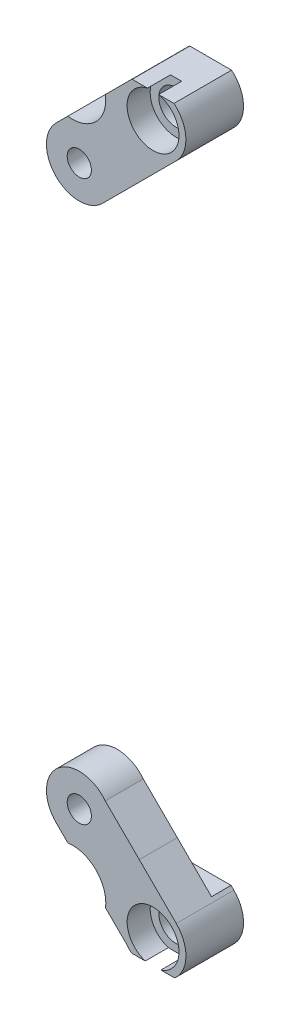
ISO-10303-21;
HEADER;
FILE_DESCRIPTION(('STEP AP214'),'2;1');
FILE_NAME('part.step','',(''),(''),'','','');
FILE_SCHEMA(('AUTOMOTIVE_DESIGN { 1 0 10303 214 1 1 1 1 }'));
ENDSEC;
DATA;
#1=APPLICATION_CONTEXT('core data for automotive mechanical design processes');
#2=APPLICATION_PROTOCOL_DEFINITION('international standard','automotive_design',2000,#1);
#3=PRODUCT_CONTEXT('',#1,'mechanical');
#4=PRODUCT('Part','Part','',(#3));
#5=PRODUCT_RELATED_PRODUCT_CATEGORY('part','',(#4));
#6=PRODUCT_DEFINITION_FORMATION('','',#4);
#7=PRODUCT_DEFINITION_CONTEXT('part definition',#1,'design');
#8=PRODUCT_DEFINITION('design','',#6,#7);
#9=PRODUCT_DEFINITION_SHAPE('','',#8);
#10=(LENGTH_UNIT() NAMED_UNIT(*) SI_UNIT(.MILLI.,.METRE.));
#11=(NAMED_UNIT(*) PLANE_ANGLE_UNIT() SI_UNIT($,.RADIAN.));
#12=(NAMED_UNIT(*) SI_UNIT($,.STERADIAN.) SOLID_ANGLE_UNIT());
#13=UNCERTAINTY_MEASURE_WITH_UNIT(LENGTH_MEASURE(1.E-05),#10,'distance_accuracy_value','');
#14=(GEOMETRIC_REPRESENTATION_CONTEXT(3) GLOBAL_UNCERTAINTY_ASSIGNED_CONTEXT((#13)) GLOBAL_UNIT_ASSIGNED_CONTEXT((#10,
#11,#12)) REPRESENTATION_CONTEXT('',''));
#15=CARTESIAN_POINT('',(0.,0.,0.));
#16=DIRECTION('',(0.,0.,1.));
#17=DIRECTION('',(1.,0.,0.));
#18=AXIS2_PLACEMENT_3D('',#15,#16,#17);
#19=CARTESIAN_POINT('',(-43.5767292653663,30.2864984479286,5.));
#20=DIRECTION('',(0.,0.,-1.));
#21=DIRECTION('',(-1.,0.,0.));
#22=AXIS2_PLACEMENT_3D('',#19,#20,#21);
#23=CYLINDRICAL_SURFACE('',#22,1.5);
#24=CARTESIAN_POINT('',(-43.5767292653663,30.2864984479286,0.));
#25=DIRECTION('',(0.,0.,1.));
#26=DIRECTION('',(1.,0.,0.));
#27=AXIS2_PLACEMENT_3D('',#24,#25,#26);
#28=CIRCLE('',#27,1.5);
#29=CARTESIAN_POINT('',(-42.0767292653662,30.2864984479286,0.));
#30=VERTEX_POINT('',#29);
#31=EDGE_CURVE('E175',#30,#30,#28,.T.);
#32=ORIENTED_EDGE('',*,*,#31,.F.);
#33=EDGE_LOOP('',(#32));
#34=FACE_BOUND('',#33,.T.);
#35=CARTESIAN_POINT('',(-43.5767292653663,30.2864984479286,3.));
#36=DIRECTION('',(0.,0.,1.));
#37=DIRECTION('',(1.,0.,0.));
#38=AXIS2_PLACEMENT_3D('',#35,#36,#37);
#39=CIRCLE('',#38,1.5);
#40=CARTESIAN_POINT('',(-42.0767292653662,30.2864984479286,3.));
#41=VERTEX_POINT('',#40);
#42=EDGE_CURVE('E46',#41,#41,#39,.T.);
#43=ORIENTED_EDGE('',*,*,#42,.T.);
#44=EDGE_LOOP('',(#43));
#45=FACE_BOUND('',#44,.T.);
#46=ADVANCED_FACE('F42',(#34,#45),#23,.F.);
#47=CARTESIAN_POINT('',(-38.9474106843814,38.9474106843816,5.));
#48=DIRECTION('',(-0.707106781186546,0.707106781186549,0.));
#49=DIRECTION('',(-0.707106781186549,-0.707106781186546,0.));
#50=AXIS2_PLACEMENT_3D('',#47,#48,#49);
#51=PLANE('',#50);
#52=DIRECTION('',(0.,0.,-1.));
#53=VECTOR('',#52,1.);
#54=CARTESIAN_POINT('',(-50.9797211058303,26.9151002629328,5.));
#55=LINE('',#54,#53);
#56=CARTESIAN_POINT('',(-50.9797211058303,26.9151002629328,5.));
#57=VERTEX_POINT('',#56);
#58=CARTESIAN_POINT('',(-50.9797211058303,26.9151002629328,1.7));
#59=VERTEX_POINT('',#58);
#60=EDGE_CURVE('E200',#57,#59,#55,.T.);
#61=ORIENTED_EDGE('',*,*,#60,.T.);
#62=DIRECTION('',(-0.707106781186549,-0.707106781186546,0.));
#63=VECTOR('',#62,1.);
#64=CARTESIAN_POINT('',(-38.9474106843814,38.9474106843816,1.7));
#65=LINE('',#64,#63);
#66=CARTESIAN_POINT('',(-51.9925274332672,25.9022939354959,1.7));
#67=VERTEX_POINT('',#66);
#68=EDGE_CURVE('E163',#59,#67,#65,.T.);
#69=ORIENTED_EDGE('',*,*,#68,.T.);
#70=DIRECTION('',(0.,0.,-1.));
#71=VECTOR('',#70,1.);
#72=CARTESIAN_POINT('',(-51.9925274332672,25.9022939354959,5.));
#73=LINE('',#72,#71);
#74=CARTESIAN_POINT('',(-51.9925274332672,25.9022939354959,5.));
#75=VERTEX_POINT('',#74);
#76=EDGE_CURVE('E235',#75,#67,#73,.T.);
#77=ORIENTED_EDGE('',*,*,#76,.F.);
#78=DIRECTION('',(0.707106781186549,0.707106781186546,0.));
#79=VECTOR('',#78,1.);
#80=CARTESIAN_POINT('',(-38.9474106843814,38.9474106843816,5.));
#81=LINE('',#80,#79);
#82=EDGE_CURVE('E171',#75,#57,#81,.T.);
#83=ORIENTED_EDGE('',*,*,#82,.T.);
#84=EDGE_LOOP('',(#61,#69,#77,#83));
#85=FACE_BOUND('',#84,.T.);
#86=ADVANCED_FACE('F44',(#85),#51,.T.);
#87=CARTESIAN_POINT('',(-49.9739446868777,23.8903735354853,5.));
#88=DIRECTION('',(0.,0.,-1.));
#89=DIRECTION('',(-1.,0.,0.));
#90=AXIS2_PLACEMENT_3D('',#87,#88,#89);
#91=CYLINDRICAL_SURFACE('',#90,2.85000000000001);
#92=CARTESIAN_POINT('',(-49.9739446868777,23.8903735354853,1.7));
#93=DIRECTION('',(0.,0.,-1.));
#94=DIRECTION('',(-1.,0.,0.));
#95=AXIS2_PLACEMENT_3D('',#92,#93,#94);
#96=CIRCLE('',#95,2.85000000000001);
#97=CARTESIAN_POINT('',(-48.006092917117,21.8288063131397,1.7));
#98=VERTEX_POINT('',#97);
#99=EDGE_CURVE('E166',#98,#67,#96,.T.);
#100=ORIENTED_EDGE('',*,*,#99,.F.);
#101=DIRECTION('',(0.,0.,-1.));
#102=VECTOR('',#101,1.);
#103=CARTESIAN_POINT('',(-48.006092917117,21.8288063131397,5.));
#104=LINE('',#103,#102);
#105=CARTESIAN_POINT('',(-48.006092917117,21.8288063131397,5.));
#106=VERTEX_POINT('',#105);
#107=EDGE_CURVE('E232',#106,#98,#104,.T.);
#108=ORIENTED_EDGE('',*,*,#107,.F.);
#109=CARTESIAN_POINT('',(-49.9739446868777,23.8903735354853,5.));
#110=DIRECTION('',(0.,0.,1.));
#111=DIRECTION('',(1.,0.,0.));
#112=AXIS2_PLACEMENT_3D('',#109,#110,#111);
#113=CIRCLE('',#112,2.85000000000001);
#114=EDGE_CURVE('E174',#75,#106,#113,.T.);
#115=ORIENTED_EDGE('',*,*,#114,.F.);
#116=ORIENTED_EDGE('',*,*,#76,.T.);
#117=EDGE_LOOP('',(#100,#108,#115,#116));
#118=FACE_BOUND('',#117,.T.);
#119=ADVANCED_FACE('F255',(#118),#91,.T.);
#120=CARTESIAN_POINT('',(-49.9739446868777,23.8903735354853,5.));
#121=DIRECTION('',(0.,0.,-1.));
#122=DIRECTION('',(-1.,0.,0.));
#123=AXIS2_PLACEMENT_3D('',#120,#121,#122);
#124=CYLINDRICAL_SURFACE('',#123,1.05);
#125=CARTESIAN_POINT('',(-49.9739446868777,23.8903735354853,5.));
#126=DIRECTION('',(0.,0.,1.));
#127=DIRECTION('',(1.,0.,0.));
#128=AXIS2_PLACEMENT_3D('',#125,#126,#127);
#129=CIRCLE('',#128,1.05);
#130=CARTESIAN_POINT('',(-48.9239446868777,23.8903735354853,5.));
#131=VERTEX_POINT('',#130);
#132=EDGE_CURVE('E197',#131,#131,#129,.T.);
#133=ORIENTED_EDGE('',*,*,#132,.T.);
#134=EDGE_LOOP('',(#133));
#135=FACE_BOUND('',#134,.T.);
#136=CARTESIAN_POINT('',(-49.9739446868777,23.8903735354853,1.7));
#137=DIRECTION('',(0.,0.,-1.));
#138=DIRECTION('',(-1.,0.,0.));
#139=AXIS2_PLACEMENT_3D('',#136,#137,#138);
#140=CIRCLE('',#139,1.05);
#141=CARTESIAN_POINT('',(-51.0239446868777,23.8903735354853,1.7));
#142=VERTEX_POINT('',#141);
#143=EDGE_CURVE('E159',#142,#142,#140,.T.);
#144=ORIENTED_EDGE('',*,*,#143,.T.);
#145=EDGE_LOOP('',(#144));
#146=FACE_BOUND('',#145,.T.);
#147=ADVANCED_FACE('F242',(#135,#146),#124,.F.);
#148=CARTESIAN_POINT('',(-34.9093780898652,34.9211139812419,5.));
#149=DIRECTION('',(-0.706987933025116,0.707225609375731,0.));
#150=DIRECTION('',(-0.707225609375731,-0.706987933025116,0.));
#151=AXIS2_PLACEMENT_3D('',#148,#149,#150);
#152=PLANE('',#151);
#153=DIRECTION('',(-0.707225609375731,-0.706987933025116,0.));
#154=VECTOR('',#153,1.);
#155=CARTESIAN_POINT('',(-34.9093780898652,34.9211139812419,1.7));
#156=LINE('',#155,#154);
#157=CARTESIAN_POINT('',(-41.7592284762038,28.0735656148252,1.7));
#158=VERTEX_POINT('',#157);
#159=EDGE_CURVE('E168',#158,#98,#156,.T.);
#160=ORIENTED_EDGE('',*,*,#159,.F.);
#161=DIRECTION('',(0.,0.,-1.));
#162=VECTOR('',#161,1.);
#163=CARTESIAN_POINT('',(-41.7592284762038,28.0735656148252,5.));
#164=LINE('',#163,#162);
#165=CARTESIAN_POINT('',(-41.7592284762038,28.0735656148252,0.));
#166=VERTEX_POINT('',#165);
#167=EDGE_CURVE('E156',#158,#166,#164,.T.);
#168=ORIENTED_EDGE('',*,*,#167,.T.);
#169=DIRECTION('',(0.707225609375731,0.706987933025116,0.));
#170=VECTOR('',#169,1.);
#171=CARTESIAN_POINT('',(-34.9093780898652,34.9211139812419,0.));
#172=LINE('',#171,#170);
#173=CARTESIAN_POINT('',(-41.5618197721783,28.2709079759755,0.));
#174=VERTEX_POINT('',#173);
#175=EDGE_CURVE('E170',#166,#174,#172,.T.);
#176=ORIENTED_EDGE('',*,*,#175,.T.);
#177=DIRECTION('',(0.,0.,-1.));
#178=VECTOR('',#177,1.);
#179=CARTESIAN_POINT('',(-41.5618197721783,28.2709079759755,5.));
#180=LINE('',#179,#178);
#181=CARTESIAN_POINT('',(-41.5618197721783,28.2709079759755,5.));
#182=VERTEX_POINT('',#181);
#183=EDGE_CURVE('E229',#182,#174,#180,.T.);
#184=ORIENTED_EDGE('',*,*,#183,.F.);
#185=DIRECTION('',(0.707225609375731,0.706987933025116,0.));
#186=VECTOR('',#185,1.);
#187=CARTESIAN_POINT('',(-34.9093780898652,34.9211139812419,5.));
#188=LINE('',#187,#186);
#189=CARTESIAN_POINT('',(-44.7807249254997,25.0530845957399,5.));
#190=VERTEX_POINT('',#189);
#191=EDGE_CURVE('E180',#190,#182,#188,.T.);
#192=ORIENTED_EDGE('',*,*,#191,.F.);
#193=DIRECTION('',(-0.707226241308526,-0.706987300879312,0.));
#194=VECTOR('',#193,1.);
#195=CARTESIAN_POINT('',(-34.9093380555816,34.921136361164,5.));
#196=LINE('',#195,#194);
#197=EDGE_CURVE('E177',#190,#106,#196,.T.);
#198=ORIENTED_EDGE('',*,*,#197,.T.);
#199=ORIENTED_EDGE('',*,*,#107,.T.);
#200=EDGE_LOOP('',(#160,#168,#176,#184,#192,#198,#199));
#201=FACE_BOUND('',#200,.T.);
#202=ADVANCED_FACE('F257',(#201),#152,.F.);
#203=CARTESIAN_POINT('',(-43.5767292653663,30.2864984479286,5.));
#204=DIRECTION('',(0.,0.,-1.));
#205=DIRECTION('',(-1.,0.,0.));
#206=AXIS2_PLACEMENT_3D('',#203,#204,#205);
#207=CYLINDRICAL_SURFACE('',#206,2.84999593173449);
#208=CARTESIAN_POINT('',(-43.5767292653663,30.2864984479286,0.));
#209=DIRECTION('',(0.,0.,1.));
#210=DIRECTION('',(1.,0.,0.));
#211=AXIS2_PLACEMENT_3D('',#208,#209,#210);
#212=CIRCLE('',#211,2.84999593173449);
#213=CARTESIAN_POINT('',(-41.7619570840613,32.4840175799065,0.));
#214=VERTEX_POINT('',#213);
#215=EDGE_CURVE('E202',#174,#214,#212,.T.);
#216=ORIENTED_EDGE('',*,*,#215,.T.);
#217=DIRECTION('',(0.,0.,-1.));
#218=VECTOR('',#217,1.);
#219=CARTESIAN_POINT('',(-41.7619570840613,32.4840175799065,5.));
#220=LINE('',#219,#218);
#221=CARTESIAN_POINT('',(-41.7619570840613,32.4840175799065,5.));
#222=VERTEX_POINT('',#221);
#223=EDGE_CURVE('E227',#222,#214,#220,.T.);
#224=ORIENTED_EDGE('',*,*,#223,.F.);
#225=CARTESIAN_POINT('',(-43.5767292653663,30.2864984479286,5.));
#226=DIRECTION('',(0.,0.,1.));
#227=DIRECTION('',(1.,0.,0.));
#228=AXIS2_PLACEMENT_3D('',#225,#226,#227);
#229=CIRCLE('',#228,2.84999593173449);
#230=EDGE_CURVE('E182',#182,#222,#229,.T.);
#231=ORIENTED_EDGE('',*,*,#230,.F.);
#232=ORIENTED_EDGE('',*,*,#183,.T.);
#233=EDGE_LOOP('',(#216,#224,#231,#232));
#234=FACE_BOUND('',#233,.T.);
#235=ADVANCED_FACE('F277',(#234),#207,.T.);
#236=CARTESIAN_POINT('',(0.,32.4840175799065,5.));
#237=DIRECTION('',(0.,1.,0.));
#238=DIRECTION('',(0.,0.,1.));
#239=AXIS2_PLACEMENT_3D('',#236,#237,#238);
#240=PLANE('',#239);
#241=DIRECTION('',(0.,0.,1.));
#242=VECTOR('',#241,1.);
#243=CARTESIAN_POINT('',(-44.0598541608032,32.4840175799065,3.));
#244=LINE('',#243,#242);
#245=CARTESIAN_POINT('',(-44.0598541608032,32.4840175799065,3.));
#246=VERTEX_POINT('',#245);
#247=CARTESIAN_POINT('',(-44.0598541608032,32.4840175799065,5.));
#248=VERTEX_POINT('',#247);
#249=EDGE_CURVE('E57',#246,#248,#244,.T.);
#250=ORIENTED_EDGE('',*,*,#249,.F.);
#251=DIRECTION('',(1.,0.,0.));
#252=VECTOR('',#251,1.);
#253=CARTESIAN_POINT('',(0.,32.4840175799065,3.));
#254=LINE('',#253,#252);
#255=CARTESIAN_POINT('',(-43.0936043699293,32.4840175799065,3.));
#256=VERTEX_POINT('',#255);
#257=EDGE_CURVE('E144',#246,#256,#254,.T.);
#258=ORIENTED_EDGE('',*,*,#257,.T.);
#259=DIRECTION('',(0.,0.,1.));
#260=VECTOR('',#259,1.);
#261=CARTESIAN_POINT('',(-43.0936043699293,32.4840175799065,3.));
#262=LINE('',#261,#260);
#263=CARTESIAN_POINT('',(-43.0936043699293,32.4840175799065,5.));
#264=VERTEX_POINT('',#263);
#265=EDGE_CURVE('E134',#264,#256,#262,.F.);
#266=ORIENTED_EDGE('',*,*,#265,.F.);
#267=DIRECTION('',(1.,0.,0.));
#268=VECTOR('',#267,1.);
#269=CARTESIAN_POINT('',(0.,32.4840175799065,5.));
#270=LINE('',#269,#268);
#271=EDGE_CURVE('E185',#264,#222,#270,.T.);
#272=ORIENTED_EDGE('',*,*,#271,.T.);
#273=ORIENTED_EDGE('',*,*,#223,.T.);
#274=DIRECTION('',(1.,0.,0.));
#275=VECTOR('',#274,1.);
#276=CARTESIAN_POINT('',(0.,32.4840175799065,0.));
#277=LINE('',#276,#275);
#278=CARTESIAN_POINT('',(-45.3915040371906,32.4840175799065,0.));
#279=VERTEX_POINT('',#278);
#280=EDGE_CURVE('E205',#279,#214,#277,.T.);
#281=ORIENTED_EDGE('',*,*,#280,.F.);
#282=DIRECTION('',(0.,0.,-1.));
#283=VECTOR('',#282,1.);
#284=CARTESIAN_POINT('',(-45.3915040371906,32.4840175799065,5.));
#285=LINE('',#284,#283);
#286=CARTESIAN_POINT('',(-45.3915040371906,32.4840175799065,5.));
#287=VERTEX_POINT('',#286);
#288=EDGE_CURVE('E225',#287,#279,#285,.T.);
#289=ORIENTED_EDGE('',*,*,#288,.F.);
#290=EDGE_CURVE('E186',#287,#248,#270,.T.);
#291=ORIENTED_EDGE('',*,*,#290,.T.);
#292=EDGE_LOOP('',(#250,#258,#266,#272,#273,#281,#289,#291));
#293=FACE_BOUND('',#292,.T.);
#294=ADVANCED_FACE('F146',(#293),#240,.T.);
#295=CARTESIAN_POINT('',(-36.5723461205655,40.4564702820381,5.));
#296=DIRECTION('',(-0.670599421401496,0.741819665428182,0.));
#297=DIRECTION('',(-0.741819665428182,-0.670599421401496,0.));
#298=AXIS2_PLACEMENT_3D('',#295,#296,#297);
#299=PLANE('',#298);
#300=DIRECTION('',(0.741819665428182,0.670599421401496,0.));
#301=VECTOR('',#300,1.);
#302=CARTESIAN_POINT('',(-36.5723461205655,40.4564702820381,0.));
#303=LINE('',#302,#301);
#304=CARTESIAN_POINT('',(-45.5925274332672,32.3022939354959,0.));
#305=VERTEX_POINT('',#304);
#306=EDGE_CURVE('E208',#305,#279,#303,.T.);
#307=ORIENTED_EDGE('',*,*,#306,.F.);
#308=DIRECTION('',(0.,0.,-1.));
#309=VECTOR('',#308,1.);
#310=CARTESIAN_POINT('',(-45.5925274332672,32.3022939354959,5.));
#311=LINE('',#310,#309);
#312=CARTESIAN_POINT('',(-45.5925274332672,32.3022939354959,5.));
#313=VERTEX_POINT('',#312);
#314=EDGE_CURVE('E223',#313,#305,#311,.T.);
#315=ORIENTED_EDGE('',*,*,#314,.F.);
#316=DIRECTION('',(0.741819665428182,0.670599421401496,0.));
#317=VECTOR('',#316,1.);
#318=CARTESIAN_POINT('',(-36.5723461205655,40.4564702820381,5.));
#319=LINE('',#318,#317);
#320=EDGE_CURVE('E188',#313,#287,#319,.T.);
#321=ORIENTED_EDGE('',*,*,#320,.T.);
#322=ORIENTED_EDGE('',*,*,#288,.T.);
#323=EDGE_LOOP('',(#307,#315,#321,#322));
#324=FACE_BOUND('',#323,.T.);
#325=ADVANCED_FACE('F284',(#324),#299,.T.);
#326=CARTESIAN_POINT('',(-38.9474106843815,38.9474106843815,5.));
#327=DIRECTION('',(-0.707106781186548,0.707106781186548,0.));
#328=DIRECTION('',(-0.707106781186548,-0.707106781186548,0.));
#329=AXIS2_PLACEMENT_3D('',#326,#327,#328);
#330=PLANE('',#329);
#331=DIRECTION('',(0.707106781186548,0.707106781186548,0.));
#332=VECTOR('',#331,1.);
#333=CARTESIAN_POINT('',(-38.9474106843815,38.9474106843815,0.));
#334=LINE('',#333,#332);
#335=CARTESIAN_POINT('',(-47.705333760704,30.1894876080591,0.));
#336=VERTEX_POINT('',#335);
#337=EDGE_CURVE('E211',#336,#305,#334,.T.);
#338=ORIENTED_EDGE('',*,*,#337,.F.);
#339=DIRECTION('',(0.,0.,-1.));
#340=VECTOR('',#339,1.);
#341=CARTESIAN_POINT('',(-47.705333760704,30.1894876080591,5.));
#342=LINE('',#341,#340);
#343=CARTESIAN_POINT('',(-47.705333760704,30.1894876080591,5.));
#344=VERTEX_POINT('',#343);
#345=EDGE_CURVE('E220',#344,#336,#342,.T.);
#346=ORIENTED_EDGE('',*,*,#345,.F.);
#347=DIRECTION('',(0.707106781186548,0.707106781186548,0.));
#348=VECTOR('',#347,1.);
#349=CARTESIAN_POINT('',(-38.9474106843815,38.9474106843815,5.));
#350=LINE('',#349,#348);
#351=EDGE_CURVE('E191',#344,#313,#350,.T.);
#352=ORIENTED_EDGE('',*,*,#351,.T.);
#353=ORIENTED_EDGE('',*,*,#314,.T.);
#354=EDGE_LOOP('',(#338,#346,#352,#353));
#355=FACE_BOUND('',#354,.T.);
#356=ADVANCED_FACE('F286',(#355),#330,.T.);
#357=CARTESIAN_POINT('',(-50.5772731068855,29.7870396091142,5.));
#358=DIRECTION('',(0.,0.,-1.));
#359=DIRECTION('',(-1.,0.,0.));
#360=AXIS2_PLACEMENT_3D('',#357,#358,#359);
#361=CYLINDRICAL_SURFACE('',#360,2.9);
#362=DIRECTION('',(0.,0.,-1.));
#363=VECTOR('',#362,1.);
#364=CARTESIAN_POINT('',(-48.2376135438517,28.0735656148252,5.));
#365=LINE('',#364,#363);
#366=CARTESIAN_POINT('',(-48.2376135438517,28.0735656148252,1.7));
#367=VERTEX_POINT('',#366);
#368=CARTESIAN_POINT('',(-48.2376135438517,28.0735656148252,0.));
#369=VERTEX_POINT('',#368);
#370=EDGE_CURVE('E65',#367,#369,#365,.T.);
#371=ORIENTED_EDGE('',*,*,#370,.F.);
#372=CARTESIAN_POINT('',(-50.5772731068855,29.7870396091142,1.7));
#373=DIRECTION('',(0.,0.,-1.));
#374=DIRECTION('',(-1.,0.,0.));
#375=AXIS2_PLACEMENT_3D('',#372,#373,#374);
#376=CIRCLE('',#375,2.9);
#377=EDGE_CURVE('E160',#367,#59,#376,.T.);
#378=ORIENTED_EDGE('',*,*,#377,.T.);
#379=ORIENTED_EDGE('',*,*,#60,.F.);
#380=CARTESIAN_POINT('',(-50.5772731068855,29.7870396091142,5.));
#381=DIRECTION('',(0.,0.,1.));
#382=DIRECTION('',(1.,0.,0.));
#383=AXIS2_PLACEMENT_3D('',#380,#381,#382);
#384=CIRCLE('',#383,2.9);
#385=EDGE_CURVE('E194',#57,#344,#384,.T.);
#386=ORIENTED_EDGE('',*,*,#385,.T.);
#387=ORIENTED_EDGE('',*,*,#345,.T.);
#388=CARTESIAN_POINT('',(-50.5772731068855,29.7870396091142,0.));
#389=DIRECTION('',(0.,0.,1.));
#390=DIRECTION('',(1.,0.,0.));
#391=AXIS2_PLACEMENT_3D('',#388,#389,#390);
#392=CIRCLE('',#391,2.9);
#393=EDGE_CURVE('E214',#369,#336,#392,.T.);
#394=ORIENTED_EDGE('',*,*,#393,.F.);
#395=EDGE_LOOP('',(#371,#378,#379,#386,#387,#394));
#396=FACE_BOUND('',#395,.T.);
#397=ADVANCED_FACE('F268',(#396),#361,.F.);
#398=CARTESIAN_POINT('',(0.,0.,5.));
#399=DIRECTION('',(0.,0.,1.));
#400=DIRECTION('',(1.,0.,0.));
#401=AXIS2_PLACEMENT_3D('',#398,#399,#400);
#402=PLANE('',#401);
#403=CARTESIAN_POINT('',(-43.5767292653663,30.2864984479286,5.));
#404=DIRECTION('',(0.,0.,1.));
#405=DIRECTION('',(1.,0.,0.));
#406=AXIS2_PLACEMENT_3D('',#403,#404,#405);
#407=CIRCLE('',#406,2.25);
#408=EDGE_CURVE('E12',#248,#264,#407,.T.);
#409=ORIENTED_EDGE('',*,*,#408,.F.);
#410=ORIENTED_EDGE('',*,*,#290,.F.);
#411=ORIENTED_EDGE('',*,*,#320,.F.);
#412=ORIENTED_EDGE('',*,*,#351,.F.);
#413=ORIENTED_EDGE('',*,*,#385,.F.);
#414=ORIENTED_EDGE('',*,*,#82,.F.);
#415=ORIENTED_EDGE('',*,*,#114,.T.);
#416=ORIENTED_EDGE('',*,*,#197,.F.);
#417=ORIENTED_EDGE('',*,*,#191,.T.);
#418=ORIENTED_EDGE('',*,*,#230,.T.);
#419=ORIENTED_EDGE('',*,*,#271,.F.);
#420=EDGE_LOOP('',(#409,#410,#411,#412,#413,#414,#415,#416,#417,#418,#419));
#421=FACE_BOUND('',#420,.T.);
#422=ORIENTED_EDGE('',*,*,#132,.F.);
#423=EDGE_LOOP('',(#422));
#424=FACE_BOUND('',#423,.T.);
#425=ADVANCED_FACE('F261',(#421,#424),#402,.T.);
#426=CARTESIAN_POINT('',(0.,0.,0.));
#427=DIRECTION('',(0.,0.,1.));
#428=DIRECTION('',(1.,0.,0.));
#429=AXIS2_PLACEMENT_3D('',#426,#427,#428);
#430=PLANE('',#429);
#431=ORIENTED_EDGE('',*,*,#175,.F.);
#432=DIRECTION('',(-1.,0.,0.));
#433=VECTOR('',#432,1.);
#434=CARTESIAN_POINT('',(0.,28.0735656148252,0.));
#435=LINE('',#434,#433);
#436=EDGE_CURVE('E51',#166,#369,#435,.T.);
#437=ORIENTED_EDGE('',*,*,#436,.T.);
#438=ORIENTED_EDGE('',*,*,#393,.T.);
#439=ORIENTED_EDGE('',*,*,#337,.T.);
#440=ORIENTED_EDGE('',*,*,#306,.T.);
#441=ORIENTED_EDGE('',*,*,#280,.T.);
#442=ORIENTED_EDGE('',*,*,#215,.F.);
#443=EDGE_LOOP('',(#431,#437,#438,#439,#440,#441,#442));
#444=FACE_BOUND('',#443,.T.);
#445=ORIENTED_EDGE('',*,*,#31,.T.);
#446=EDGE_LOOP('',(#445));
#447=FACE_BOUND('',#446,.T.);
#448=ADVANCED_FACE('F248',(#444,#447),#430,.F.);
#449=CARTESIAN_POINT('',(0.,0.,1.7));
#450=DIRECTION('',(0.,0.,-1.));
#451=DIRECTION('',(-1.,0.,0.));
#452=AXIS2_PLACEMENT_3D('',#449,#450,#451);
#453=PLANE('',#452);
#454=ORIENTED_EDGE('',*,*,#143,.F.);
#455=EDGE_LOOP('',(#454));
#456=FACE_BOUND('',#455,.T.);
#457=ORIENTED_EDGE('',*,*,#159,.T.);
#458=ORIENTED_EDGE('',*,*,#99,.T.);
#459=ORIENTED_EDGE('',*,*,#68,.F.);
#460=ORIENTED_EDGE('',*,*,#377,.F.);
#461=DIRECTION('',(1.,0.,0.));
#462=VECTOR('',#461,1.);
#463=CARTESIAN_POINT('',(-37.2430289190413,28.0735656148252,1.7));
#464=LINE('',#463,#462);
#465=EDGE_CURVE('E148',#367,#158,#464,.T.);
#466=ORIENTED_EDGE('',*,*,#465,.T.);
#467=EDGE_LOOP('',(#457,#458,#459,#460,#466));
#468=FACE_BOUND('',#467,.T.);
#469=ADVANCED_FACE('F244',(#456,#468),#453,.T.);
#470=CARTESIAN_POINT('',(-37.2430289190413,28.0735656148252,1.7));
#471=DIRECTION('',(0.,1.,0.));
#472=DIRECTION('',(0.,0.,1.));
#473=AXIS2_PLACEMENT_3D('',#470,#471,#472);
#474=PLANE('',#473);
#475=ORIENTED_EDGE('',*,*,#465,.F.);
#476=ORIENTED_EDGE('',*,*,#370,.T.);
#477=ORIENTED_EDGE('',*,*,#436,.F.);
#478=ORIENTED_EDGE('',*,*,#167,.F.);
#479=EDGE_LOOP('',(#475,#476,#477,#478));
#480=FACE_BOUND('',#479,.T.);
#481=ADVANCED_FACE('F247',(#480),#474,.F.);
#482=CARTESIAN_POINT('',(-43.5767292653663,30.2864984479286,3.));
#483=DIRECTION('',(0.,0.,1.));
#484=DIRECTION('',(1.,0.,0.));
#485=AXIS2_PLACEMENT_3D('',#482,#483,#484);
#486=CYLINDRICAL_SURFACE('',#485,2.25);
#487=ORIENTED_EDGE('',*,*,#249,.T.);
#488=ORIENTED_EDGE('',*,*,#408,.T.);
#489=ORIENTED_EDGE('',*,*,#265,.T.);
#490=CARTESIAN_POINT('',(-43.5767292653663,30.2864984479286,3.));
#491=DIRECTION('',(0.,0.,1.));
#492=DIRECTION('',(1.,0.,0.));
#493=AXIS2_PLACEMENT_3D('',#490,#491,#492);
#494=CIRCLE('',#493,2.25);
#495=EDGE_CURVE('E137',#246,#256,#494,.T.);
#496=ORIENTED_EDGE('',*,*,#495,.F.);
#497=EDGE_LOOP('',(#487,#488,#489,#496));
#498=FACE_BOUND('',#497,.T.);
#499=ADVANCED_FACE('F136',(#498),#486,.F.);
#500=CARTESIAN_POINT('',(-43.5767292653663,30.2864984479286,3.));
#501=DIRECTION('',(0.,0.,1.));
#502=DIRECTION('',(1.,0.,0.));
#503=AXIS2_PLACEMENT_3D('',#500,#501,#502);
#504=PLANE('',#503);
#505=ORIENTED_EDGE('',*,*,#42,.F.);
#506=EDGE_LOOP('',(#505));
#507=FACE_BOUND('',#506,.T.);
#508=ORIENTED_EDGE('',*,*,#495,.T.);
#509=ORIENTED_EDGE('',*,*,#257,.F.);
#510=EDGE_LOOP('',(#508,#509));
#511=FACE_BOUND('',#510,.T.);
#512=ADVANCED_FACE('F143',(#507,#511),#504,.T.);
#513=CLOSED_SHELL('',(#46,#86,#119,#147,#202,#235,#294,#325,#356,#397,#425,#448,#469,#481,#499,#512));
#514=MANIFOLD_SOLID_BREP('B2',#513);
#515=CARTESIAN_POINT('',(-43.5738675976098,-31.0495528823525,5.));
#516=DIRECTION('',(0.,0.,-1.));
#517=DIRECTION('',(-1.,0.,0.));
#518=AXIS2_PLACEMENT_3D('',#515,#516,#517);
#519=CYLINDRICAL_SURFACE('',#518,1.5);
#520=CARTESIAN_POINT('',(-43.5738675976098,-31.0495528823525,0.));
#521=DIRECTION('',(0.,0.,1.));
#522=DIRECTION('',(1.,0.,0.));
#523=AXIS2_PLACEMENT_3D('',#520,#521,#522);
#524=CIRCLE('',#523,1.5);
#525=CARTESIAN_POINT('',(-42.0738675976098,-31.0495528823525,0.));
#526=VERTEX_POINT('',#525);
#527=EDGE_CURVE('E568',#526,#526,#524,.T.);
#528=ORIENTED_EDGE('',*,*,#527,.F.);
#529=EDGE_LOOP('',(#528));
#530=FACE_BOUND('',#529,.T.);
#531=CARTESIAN_POINT('',(-43.5738675976098,-31.0495528823525,3.));
#532=DIRECTION('',(0.,0.,1.));
#533=DIRECTION('',(1.,0.,0.));
#534=AXIS2_PLACEMENT_3D('',#531,#532,#533);
#535=CIRCLE('',#534,1.5);
#536=CARTESIAN_POINT('',(-42.0738675976098,-31.0495528823525,3.));
#537=VERTEX_POINT('',#536);
#538=EDGE_CURVE('E436',#537,#537,#535,.T.);
#539=ORIENTED_EDGE('',*,*,#538,.T.);
#540=EDGE_LOOP('',(#539));
#541=FACE_BOUND('',#540,.T.);
#542=ADVANCED_FACE('F432',(#530,#541),#519,.F.);
#543=CARTESIAN_POINT('',(-35.1505085427414,-35.389381038265,5.));
#544=DIRECTION('',(-0.704708232186591,-0.709497221621374,0.));
#545=DIRECTION('',(0.709497221621374,-0.704708232186591,0.));
#546=AXIS2_PLACEMENT_3D('',#543,#544,#545);
#547=PLANE('',#546);
#548=DIRECTION('',(0.709497221621374,-0.704708232186591,0.));
#549=VECTOR('',#548,1.);
#550=CARTESIAN_POINT('',(-35.1505085427414,-35.389381038265,1.7));
#551=LINE('',#550,#549);
#552=CARTESIAN_POINT('',(-47.7217536048302,-22.9029898106238,1.7));
#553=VERTEX_POINT('',#552);
#554=CARTESIAN_POINT('',(-44.7701982058117,-25.8346226966411,1.7));
#555=VERTEX_POINT('',#554);
#556=EDGE_CURVE('E554',#553,#555,#551,.T.);
#557=ORIENTED_EDGE('',*,*,#556,.F.);
#558=DIRECTION('',(0.,0.,-1.));
#559=VECTOR('',#558,1.);
#560=CARTESIAN_POINT('',(-47.7217536048301,-22.9029898106238,5.));
#561=LINE('',#560,#559);
#562=CARTESIAN_POINT('',(-47.7217536048301,-22.9029898106238,5.));
#563=VERTEX_POINT('',#562);
#564=EDGE_CURVE('E628',#563,#553,#561,.T.);
#565=ORIENTED_EDGE('',*,*,#564,.F.);
#566=DIRECTION('',(-0.709497221621374,0.704708232186591,0.));
#567=VECTOR('',#566,1.);
#568=CARTESIAN_POINT('',(-35.1505085427414,-35.389381038265,5.));
#569=LINE('',#568,#567);
#570=CARTESIAN_POINT('',(-44.7701982058117,-25.8346226966411,5.));
#571=VERTEX_POINT('',#570);
#572=EDGE_CURVE('E564',#571,#563,#569,.T.);
#573=ORIENTED_EDGE('',*,*,#572,.F.);
#574=DIRECTION('',(0.,0.,-1.));
#575=VECTOR('',#574,1.);
#576=CARTESIAN_POINT('',(-44.7701982058117,-25.8346226966411,5.));
#577=LINE('',#576,#575);
#578=EDGE_CURVE('E590',#571,#555,#577,.T.);
#579=ORIENTED_EDGE('',*,*,#578,.T.);
#580=EDGE_LOOP('',(#557,#565,#573,#579));
#581=FACE_BOUND('',#580,.T.);
#582=ADVANCED_FACE('F434',(#581),#547,.F.);
#583=CARTESIAN_POINT('',(-49.9738675976098,-24.6495528823525,5.));
#584=DIRECTION('',(0.,0.,-1.));
#585=DIRECTION('',(-1.,0.,0.));
#586=AXIS2_PLACEMENT_3D('',#583,#584,#585);
#587=CYLINDRICAL_SURFACE('',#586,2.85);
#588=CARTESIAN_POINT('',(-49.9738675976098,-24.6495528823525,1.7));
#589=DIRECTION('',(0.,0.,-1.));
#590=DIRECTION('',(-1.,0.,0.));
#591=AXIS2_PLACEMENT_3D('',#588,#589,#590);
#592=CIRCLE('',#591,2.85);
#593=CARTESIAN_POINT('',(-51.9754271636713,-26.6784095316768,1.7));
#594=VERTEX_POINT('',#593);
#595=EDGE_CURVE('E556',#594,#553,#592,.T.);
#596=ORIENTED_EDGE('',*,*,#595,.F.);
#597=DIRECTION('',(0.,0.,-1.));
#598=VECTOR('',#597,1.);
#599=CARTESIAN_POINT('',(-51.9754271636713,-26.6784095316768,5.));
#600=LINE('',#599,#598);
#601=CARTESIAN_POINT('',(-51.9754271636713,-26.6784095316768,5.));
#602=VERTEX_POINT('',#601);
#603=EDGE_CURVE('E625',#602,#594,#600,.T.);
#604=ORIENTED_EDGE('',*,*,#603,.F.);
#605=CARTESIAN_POINT('',(-49.9738675976098,-24.6495528823525,5.));
#606=DIRECTION('',(0.,0.,1.));
#607=DIRECTION('',(1.,0.,0.));
#608=AXIS2_PLACEMENT_3D('',#605,#606,#607);
#609=CIRCLE('',#608,2.85);
#610=EDGE_CURVE('E567',#563,#602,#609,.T.);
#611=ORIENTED_EDGE('',*,*,#610,.F.);
#612=ORIENTED_EDGE('',*,*,#564,.T.);
#613=EDGE_LOOP('',(#596,#604,#611,#612));
#614=FACE_BOUND('',#613,.T.);
#615=ADVANCED_FACE('F649',(#614),#587,.T.);
#616=CARTESIAN_POINT('',(-39.1506076425322,-39.4166636325181,5.));
#617=DIRECTION('',(0.704708232186588,0.709497221621377,0.));
#618=DIRECTION('',(-0.709497221621377,0.704708232186588,0.));
#619=AXIS2_PLACEMENT_3D('',#616,#617,#618);
#620=PLANE('',#619);
#621=DIRECTION('',(-0.709497221621377,0.704708232186588,0.));
#622=VECTOR('',#621,1.);
#623=CARTESIAN_POINT('',(-39.1506076425322,-39.4166636325181,1.7));
#624=LINE('',#623,#622);
#625=CARTESIAN_POINT('',(-50.970278135918,-27.6767739689799,1.7));
#626=VERTEX_POINT('',#625);
#627=EDGE_CURVE('E558',#626,#594,#624,.T.);
#628=ORIENTED_EDGE('',*,*,#627,.F.);
#629=DIRECTION('',(0.,0.,-1.));
#630=VECTOR('',#629,1.);
#631=CARTESIAN_POINT('',(-50.970278135918,-27.6767739689799,5.));
#632=LINE('',#631,#630);
#633=CARTESIAN_POINT('',(-50.970278135918,-27.6767739689799,5.));
#634=VERTEX_POINT('',#633);
#635=EDGE_CURVE('E622',#634,#626,#632,.T.);
#636=ORIENTED_EDGE('',*,*,#635,.F.);
#637=DIRECTION('',(0.709497221621377,-0.704708232186588,0.));
#638=VECTOR('',#637,1.);
#639=CARTESIAN_POINT('',(-39.1506076425322,-39.4166636325181,5.));
#640=LINE('',#639,#638);
#641=EDGE_CURVE('E570',#602,#634,#640,.T.);
#642=ORIENTED_EDGE('',*,*,#641,.F.);
#643=ORIENTED_EDGE('',*,*,#603,.T.);
#644=EDGE_LOOP('',(#628,#636,#642,#643));
#645=FACE_BOUND('',#644,.T.);
#646=ADVANCED_FACE('F652',(#645),#620,.F.);
#647=CARTESIAN_POINT('',(-49.9738675976098,-24.6495528823525,5.));
#648=DIRECTION('',(0.,0.,-1.));
#649=DIRECTION('',(-1.,0.,0.));
#650=AXIS2_PLACEMENT_3D('',#647,#648,#649);
#651=CYLINDRICAL_SURFACE('',#650,1.05);
#652=CARTESIAN_POINT('',(-49.9738675976098,-24.6495528823525,5.));
#653=DIRECTION('',(0.,0.,1.));
#654=DIRECTION('',(1.,0.,0.));
#655=AXIS2_PLACEMENT_3D('',#652,#653,#654);
#656=CIRCLE('',#655,1.05);
#657=CARTESIAN_POINT('',(-48.9238675976098,-24.6495528823525,5.));
#658=VERTEX_POINT('',#657);
#659=EDGE_CURVE('E587',#658,#658,#656,.T.);
#660=ORIENTED_EDGE('',*,*,#659,.T.);
#661=EDGE_LOOP('',(#660));
#662=FACE_BOUND('',#661,.T.);
#663=CARTESIAN_POINT('',(-49.9738675976098,-24.6495528823525,1.7));
#664=DIRECTION('',(0.,0.,-1.));
#665=DIRECTION('',(-1.,0.,0.));
#666=AXIS2_PLACEMENT_3D('',#663,#664,#665);
#667=CIRCLE('',#666,1.05);
#668=CARTESIAN_POINT('',(-51.0238675976098,-24.6495528823525,1.7));
#669=VERTEX_POINT('',#668);
#670=EDGE_CURVE('E551',#669,#669,#667,.T.);
#671=ORIENTED_EDGE('',*,*,#670,.T.);
#672=EDGE_LOOP('',(#671));
#673=FACE_BOUND('',#672,.T.);
#674=ADVANCED_FACE('F635',(#662,#673),#651,.F.);
#675=CARTESIAN_POINT('',(-50.5738675976098,-30.5495528823525,5.));
#676=DIRECTION('',(0.,0.,-1.));
#677=DIRECTION('',(-1.,0.,0.));
#678=AXIS2_PLACEMENT_3D('',#675,#676,#677);
#679=CYLINDRICAL_SURFACE('',#678,2.9);
#680=DIRECTION('',(0.,0.,-1.));
#681=VECTOR('',#680,1.);
#682=CARTESIAN_POINT('',(-48.26929852544,-28.7891661658612,5.));
#683=LINE('',#682,#681);
#684=CARTESIAN_POINT('',(-48.26929852544,-28.7891661658612,0.));
#685=VERTEX_POINT('',#684);
#686=CARTESIAN_POINT('',(-48.26929852544,-28.7891661658612,1.7));
#687=VERTEX_POINT('',#686);
#688=EDGE_CURVE('E549',#685,#687,#683,.F.);
#689=ORIENTED_EDGE('',*,*,#688,.F.);
#690=CARTESIAN_POINT('',(-50.5738675976098,-30.5495528823525,0.));
#691=DIRECTION('',(0.,0.,1.));
#692=DIRECTION('',(1.,0.,0.));
#693=AXIS2_PLACEMENT_3D('',#690,#691,#692);
#694=CIRCLE('',#693,2.9);
#695=CARTESIAN_POINT('',(-47.698469833806,-30.926498103721,0.));
#696=VERTEX_POINT('',#695);
#697=EDGE_CURVE('E563',#696,#685,#694,.T.);
#698=ORIENTED_EDGE('',*,*,#697,.F.);
#699=DIRECTION('',(0.,0.,-1.));
#700=VECTOR('',#699,1.);
#701=CARTESIAN_POINT('',(-47.698469833806,-30.926498103721,5.));
#702=LINE('',#701,#700);
#703=CARTESIAN_POINT('',(-47.698469833806,-30.926498103721,5.));
#704=VERTEX_POINT('',#703);
#705=EDGE_CURVE('E620',#704,#696,#702,.T.);
#706=ORIENTED_EDGE('',*,*,#705,.F.);
#707=CARTESIAN_POINT('',(-50.5738675976098,-30.5495528823525,5.));
#708=DIRECTION('',(0.,0.,1.));
#709=DIRECTION('',(1.,0.,0.));
#710=AXIS2_PLACEMENT_3D('',#707,#708,#709);
#711=CIRCLE('',#710,2.9);
#712=EDGE_CURVE('E572',#704,#634,#711,.T.);
#713=ORIENTED_EDGE('',*,*,#712,.T.);
#714=ORIENTED_EDGE('',*,*,#635,.T.);
#715=CARTESIAN_POINT('',(-50.5738675976098,-30.5495528823525,1.7));
#716=DIRECTION('',(0.,0.,-1.));
#717=DIRECTION('',(-1.,0.,0.));
#718=AXIS2_PLACEMENT_3D('',#715,#716,#717);
#719=CIRCLE('',#718,2.9);
#720=EDGE_CURVE('E560',#626,#687,#719,.T.);
#721=ORIENTED_EDGE('',*,*,#720,.T.);
#722=EDGE_LOOP('',(#689,#698,#706,#713,#714,#721));
#723=FACE_BOUND('',#722,.T.);
#724=ADVANCED_FACE('F675',(#723),#679,.F.);
#725=CARTESIAN_POINT('',(-39.1506076425323,-39.416663632518,5.));
#726=DIRECTION('',(0.704708232186591,0.709497221621375,0.));
#727=DIRECTION('',(-0.709497221621375,0.704708232186591,0.));
#728=AXIS2_PLACEMENT_3D('',#725,#726,#727);
#729=PLANE('',#728);
#730=DIRECTION('',(0.709497221621375,-0.704708232186591,0.));
#731=VECTOR('',#730,1.);
#732=CARTESIAN_POINT('',(-39.1506076425323,-39.416663632518,0.));
#733=LINE('',#732,#731);
#734=CARTESIAN_POINT('',(-45.8565070510267,-32.7560279409761,0.));
#735=VERTEX_POINT('',#734);
#736=EDGE_CURVE('E593',#696,#735,#733,.T.);
#737=ORIENTED_EDGE('',*,*,#736,.T.);
#738=DIRECTION('',(0.,0.,-1.));
#739=VECTOR('',#738,1.);
#740=CARTESIAN_POINT('',(-45.8565070510267,-32.7560279409761,5.));
#741=LINE('',#740,#739);
#742=CARTESIAN_POINT('',(-45.8565070510267,-32.7560279409761,5.));
#743=VERTEX_POINT('',#742);
#744=EDGE_CURVE('E617',#743,#735,#741,.T.);
#745=ORIENTED_EDGE('',*,*,#744,.F.);
#746=DIRECTION('',(0.709497221621375,-0.704708232186591,0.));
#747=VECTOR('',#746,1.);
#748=CARTESIAN_POINT('',(-39.1506076425323,-39.416663632518,5.));
#749=LINE('',#748,#747);
#750=EDGE_CURVE('E575',#704,#743,#749,.T.);
#751=ORIENTED_EDGE('',*,*,#750,.F.);
#752=ORIENTED_EDGE('',*,*,#705,.T.);
#753=EDGE_LOOP('',(#737,#745,#751,#752));
#754=FACE_BOUND('',#753,.T.);
#755=ADVANCED_FACE('F679',(#754),#729,.F.);
#756=CARTESIAN_POINT('',(-43.5738675976098,-31.0495528823525,5.));
#757=DIRECTION('',(0.,0.,-1.));
#758=DIRECTION('',(-1.,0.,0.));
#759=AXIS2_PLACEMENT_3D('',#756,#757,#758);
#760=CYLINDRICAL_SURFACE('',#759,2.85);
#761=CARTESIAN_POINT('',(-43.5738675976098,-31.0495528823525,0.));
#762=DIRECTION('',(0.,0.,1.));
#763=DIRECTION('',(1.,0.,0.));
#764=AXIS2_PLACEMENT_3D('',#761,#762,#763);
#765=CIRCLE('',#764,2.85);
#766=CARTESIAN_POINT('',(-45.4495833368332,-33.19529062626,0.));
#767=VERTEX_POINT('',#766);
#768=EDGE_CURVE('E595',#735,#767,#765,.T.);
#769=ORIENTED_EDGE('',*,*,#768,.T.);
#770=DIRECTION('',(0.,0.,-1.));
#771=VECTOR('',#770,1.);
#772=CARTESIAN_POINT('',(-45.4495833368332,-33.19529062626,5.));
#773=LINE('',#772,#771);
#774=CARTESIAN_POINT('',(-45.4495833368332,-33.19529062626,5.));
#775=VERTEX_POINT('',#774);
#776=EDGE_CURVE('E615',#775,#767,#773,.T.);
#777=ORIENTED_EDGE('',*,*,#776,.F.);
#778=CARTESIAN_POINT('',(-43.5738675976098,-31.0495528823525,5.));
#779=DIRECTION('',(0.,0.,1.));
#780=DIRECTION('',(1.,0.,0.));
#781=AXIS2_PLACEMENT_3D('',#778,#779,#780);
#782=CIRCLE('',#781,2.85);
#783=EDGE_CURVE('E577',#743,#775,#782,.T.);
#784=ORIENTED_EDGE('',*,*,#783,.F.);
#785=ORIENTED_EDGE('',*,*,#744,.T.);
#786=EDGE_LOOP('',(#769,#777,#784,#785));
#787=FACE_BOUND('',#786,.T.);
#788=ADVANCED_FACE('F683',(#787),#760,.T.);
#789=CARTESIAN_POINT('',(0.,-33.19529062626,5.));
#790=DIRECTION('',(0.,-1.,0.));
#791=DIRECTION('',(0.,0.,-1.));
#792=AXIS2_PLACEMENT_3D('',#789,#790,#791);
#793=PLANE('',#792);
#794=DIRECTION('',(0.,0.,1.));
#795=VECTOR('',#794,1.);
#796=CARTESIAN_POINT('',(-42.8968819741505,-33.19529062626,3.));
#797=LINE('',#796,#795);
#798=CARTESIAN_POINT('',(-42.8968819741505,-33.19529062626,3.));
#799=VERTEX_POINT('',#798);
#800=CARTESIAN_POINT('',(-42.8968819741505,-33.19529062626,5.));
#801=VERTEX_POINT('',#800);
#802=EDGE_CURVE('E447',#799,#801,#797,.T.);
#803=ORIENTED_EDGE('',*,*,#802,.F.);
#804=DIRECTION('',(-1.,0.,0.));
#805=VECTOR('',#804,1.);
#806=CARTESIAN_POINT('',(0.,-33.19529062626,3.));
#807=LINE('',#806,#805);
#808=CARTESIAN_POINT('',(-44.2508532210691,-33.19529062626,3.));
#809=VERTEX_POINT('',#808);
#810=EDGE_CURVE('E537',#799,#809,#807,.T.);
#811=ORIENTED_EDGE('',*,*,#810,.T.);
#812=DIRECTION('',(0.,0.,1.));
#813=VECTOR('',#812,1.);
#814=CARTESIAN_POINT('',(-44.2508532210691,-33.19529062626,3.));
#815=LINE('',#814,#813);
#816=CARTESIAN_POINT('',(-44.2508532210691,-33.19529062626,5.));
#817=VERTEX_POINT('',#816);
#818=EDGE_CURVE('E527',#817,#809,#815,.F.);
#819=ORIENTED_EDGE('',*,*,#818,.F.);
#820=DIRECTION('',(-1.,0.,0.));
#821=VECTOR('',#820,1.);
#822=CARTESIAN_POINT('',(0.,-33.19529062626,5.));
#823=LINE('',#822,#821);
#824=EDGE_CURVE('E580',#817,#775,#823,.T.);
#825=ORIENTED_EDGE('',*,*,#824,.T.);
#826=ORIENTED_EDGE('',*,*,#776,.T.);
#827=DIRECTION('',(-1.,0.,0.));
#828=VECTOR('',#827,1.);
#829=CARTESIAN_POINT('',(0.,-33.19529062626,0.));
#830=LINE('',#829,#828);
#831=CARTESIAN_POINT('',(-41.6981518583863,-33.19529062626,0.));
#832=VERTEX_POINT('',#831);
#833=EDGE_CURVE('E598',#832,#767,#830,.T.);
#834=ORIENTED_EDGE('',*,*,#833,.F.);
#835=DIRECTION('',(0.,0.,-1.));
#836=VECTOR('',#835,1.);
#837=CARTESIAN_POINT('',(-41.6981518583863,-33.19529062626,5.));
#838=LINE('',#837,#836);
#839=CARTESIAN_POINT('',(-41.6981518583863,-33.19529062626,5.));
#840=VERTEX_POINT('',#839);
#841=EDGE_CURVE('E613',#840,#832,#838,.T.);
#842=ORIENTED_EDGE('',*,*,#841,.F.);
#843=EDGE_CURVE('E581',#840,#801,#823,.T.);
#844=ORIENTED_EDGE('',*,*,#843,.T.);
#845=EDGE_LOOP('',(#803,#811,#819,#825,#826,#834,#842,#844));
#846=FACE_BOUND('',#845,.T.);
#847=ADVANCED_FACE('F539',(#846),#793,.T.);
#848=CARTESIAN_POINT('',(-43.5738675976098,-31.0495528823525,5.));
#849=DIRECTION('',(0.,0.,-1.));
#850=DIRECTION('',(-1.,0.,0.));
#851=AXIS2_PLACEMENT_3D('',#848,#849,#850);
#852=CYLINDRICAL_SURFACE('',#851,2.85);
#853=CARTESIAN_POINT('',(-43.5738675976098,-31.0495528823525,0.));
#854=DIRECTION('',(0.,0.,1.));
#855=DIRECTION('',(1.,0.,0.));
#856=AXIS2_PLACEMENT_3D('',#853,#854,#855);
#857=CIRCLE('',#856,2.85);
#858=CARTESIAN_POINT('',(-41.5623623184378,-29.0305564703043,0.));
#859=VERTEX_POINT('',#858);
#860=EDGE_CURVE('E601',#832,#859,#857,.T.);
#861=ORIENTED_EDGE('',*,*,#860,.T.);
#862=DIRECTION('',(0.,0.,-1.));
#863=VECTOR('',#862,1.);
#864=CARTESIAN_POINT('',(-41.5623623184378,-29.0305564703043,5.));
#865=LINE('',#864,#863);
#866=CARTESIAN_POINT('',(-41.5623623184378,-29.0305564703043,5.));
#867=VERTEX_POINT('',#866);
#868=EDGE_CURVE('E610',#867,#859,#865,.T.);
#869=ORIENTED_EDGE('',*,*,#868,.F.);
#870=CARTESIAN_POINT('',(-43.5738675976098,-31.0495528823525,5.));
#871=DIRECTION('',(0.,0.,1.));
#872=DIRECTION('',(1.,0.,0.));
#873=AXIS2_PLACEMENT_3D('',#870,#871,#872);
#874=CIRCLE('',#873,2.85);
#875=EDGE_CURVE('E583',#840,#867,#874,.T.);
#876=ORIENTED_EDGE('',*,*,#875,.F.);
#877=ORIENTED_EDGE('',*,*,#841,.T.);
#878=EDGE_LOOP('',(#861,#869,#876,#877));
#879=FACE_BOUND('',#878,.T.);
#880=ADVANCED_FACE('F688',(#879),#852,.T.);
#881=CARTESIAN_POINT('',(-35.2191111332785,-35.3502721319669,5.));
#882=DIRECTION('',(-0.705791326025238,-0.708419793701119,0.));
#883=DIRECTION('',(0.708419793701119,-0.705791326025239,0.));
#884=AXIS2_PLACEMENT_3D('',#881,#882,#883);
#885=PLANE('',#884);
#886=DIRECTION('',(-0.708419793701119,0.705791326025239,0.));
#887=VECTOR('',#886,1.);
#888=CARTESIAN_POINT('',(-35.2191111332785,-35.3502721319669,0.));
#889=LINE('',#888,#887);
#890=CARTESIAN_POINT('',(-41.804651594842,-28.7891661658612,0.));
#891=VERTEX_POINT('',#890);
#892=EDGE_CURVE('E603',#859,#891,#889,.T.);
#893=ORIENTED_EDGE('',*,*,#892,.T.);
#894=DIRECTION('',(0.,0.,1.));
#895=VECTOR('',#894,1.);
#896=CARTESIAN_POINT('',(-41.804651594842,-28.7891661658612,5.));
#897=LINE('',#896,#895);
#898=CARTESIAN_POINT('',(-41.804651594842,-28.7891661658612,1.7));
#899=VERTEX_POINT('',#898);
#900=EDGE_CURVE('E455',#891,#899,#897,.T.);
#901=ORIENTED_EDGE('',*,*,#900,.T.);
#902=DIRECTION('',(0.708419793701119,-0.705791326025239,0.));
#903=VECTOR('',#902,1.);
#904=CARTESIAN_POINT('',(-35.2191111332785,-35.3502721319669,1.7));
#905=LINE('',#904,#903);
#906=EDGE_CURVE('E552',#555,#899,#905,.T.);
#907=ORIENTED_EDGE('',*,*,#906,.F.);
#908=ORIENTED_EDGE('',*,*,#578,.F.);
#909=DIRECTION('',(-0.708419793701119,0.705791326025239,0.));
#910=VECTOR('',#909,1.);
#911=CARTESIAN_POINT('',(-35.2191111332785,-35.3502721319669,5.));
#912=LINE('',#911,#910);
#913=EDGE_CURVE('E585',#867,#571,#912,.T.);
#914=ORIENTED_EDGE('',*,*,#913,.F.);
#915=ORIENTED_EDGE('',*,*,#868,.T.);
#916=EDGE_LOOP('',(#893,#901,#907,#908,#914,#915));
#917=FACE_BOUND('',#916,.T.);
#918=ADVANCED_FACE('F663',(#917),#885,.F.);
#919=CARTESIAN_POINT('',(0.,0.,5.));
#920=DIRECTION('',(0.,0.,1.));
#921=DIRECTION('',(1.,0.,0.));
#922=AXIS2_PLACEMENT_3D('',#919,#920,#921);
#923=PLANE('',#922);
#924=CARTESIAN_POINT('',(-43.5738675976098,-31.0495528823525,5.));
#925=DIRECTION('',(0.,0.,1.));
#926=DIRECTION('',(1.,0.,0.));
#927=AXIS2_PLACEMENT_3D('',#924,#925,#926);
#928=CIRCLE('',#927,2.25);
#929=EDGE_CURVE('E40',#801,#817,#928,.T.);
#930=ORIENTED_EDGE('',*,*,#929,.F.);
#931=ORIENTED_EDGE('',*,*,#843,.F.);
#932=ORIENTED_EDGE('',*,*,#875,.T.);
#933=ORIENTED_EDGE('',*,*,#913,.T.);
#934=ORIENTED_EDGE('',*,*,#572,.T.);
#935=ORIENTED_EDGE('',*,*,#610,.T.);
#936=ORIENTED_EDGE('',*,*,#641,.T.);
#937=ORIENTED_EDGE('',*,*,#712,.F.);
#938=ORIENTED_EDGE('',*,*,#750,.T.);
#939=ORIENTED_EDGE('',*,*,#783,.T.);
#940=ORIENTED_EDGE('',*,*,#824,.F.);
#941=EDGE_LOOP('',(#930,#931,#932,#933,#934,#935,#936,#937,#938,#939,#940));
#942=FACE_BOUND('',#941,.T.);
#943=ORIENTED_EDGE('',*,*,#659,.F.);
#944=EDGE_LOOP('',(#943));
#945=FACE_BOUND('',#944,.T.);
#946=ADVANCED_FACE('F655',(#942,#945),#923,.T.);
#947=CARTESIAN_POINT('',(0.,0.,0.));
#948=DIRECTION('',(0.,0.,1.));
#949=DIRECTION('',(1.,0.,0.));
#950=AXIS2_PLACEMENT_3D('',#947,#948,#949);
#951=PLANE('',#950);
#952=ORIENTED_EDGE('',*,*,#697,.T.);
#953=DIRECTION('',(1.,0.,0.));
#954=VECTOR('',#953,1.);
#955=CARTESIAN_POINT('',(0.,-28.7891661658612,0.));
#956=LINE('',#955,#954);
#957=EDGE_CURVE('E441',#685,#891,#956,.T.);
#958=ORIENTED_EDGE('',*,*,#957,.T.);
#959=ORIENTED_EDGE('',*,*,#892,.F.);
#960=ORIENTED_EDGE('',*,*,#860,.F.);
#961=ORIENTED_EDGE('',*,*,#833,.T.);
#962=ORIENTED_EDGE('',*,*,#768,.F.);
#963=ORIENTED_EDGE('',*,*,#736,.F.);
#964=EDGE_LOOP('',(#952,#958,#959,#960,#961,#962,#963));
#965=FACE_BOUND('',#964,.T.);
#966=ORIENTED_EDGE('',*,*,#527,.T.);
#967=EDGE_LOOP('',(#966));
#968=FACE_BOUND('',#967,.T.);
#969=ADVANCED_FACE('F668',(#965,#968),#951,.F.);
#970=CARTESIAN_POINT('',(-37.2430289190413,-28.7891661658612,1.7));
#971=DIRECTION('',(0.,-1.,0.));
#972=DIRECTION('',(0.,0.,-1.));
#973=AXIS2_PLACEMENT_3D('',#970,#971,#972);
#974=PLANE('',#973);
#975=ORIENTED_EDGE('',*,*,#688,.T.);
#976=DIRECTION('',(-1.,0.,0.));
#977=VECTOR('',#976,1.);
#978=CARTESIAN_POINT('',(-37.2430289190413,-28.7891661658612,1.7));
#979=LINE('',#978,#977);
#980=EDGE_CURVE('E541',#899,#687,#979,.T.);
#981=ORIENTED_EDGE('',*,*,#980,.F.);
#982=ORIENTED_EDGE('',*,*,#900,.F.);
#983=ORIENTED_EDGE('',*,*,#957,.F.);
#984=EDGE_LOOP('',(#975,#981,#982,#983));
#985=FACE_BOUND('',#984,.T.);
#986=ADVANCED_FACE('F640',(#985),#974,.F.);
#987=CARTESIAN_POINT('',(0.,0.,1.7));
#988=DIRECTION('',(0.,0.,-1.));
#989=DIRECTION('',(-1.,0.,0.));
#990=AXIS2_PLACEMENT_3D('',#987,#988,#989);
#991=PLANE('',#990);
#992=ORIENTED_EDGE('',*,*,#670,.F.);
#993=EDGE_LOOP('',(#992));
#994=FACE_BOUND('',#993,.T.);
#995=ORIENTED_EDGE('',*,*,#627,.T.);
#996=ORIENTED_EDGE('',*,*,#595,.T.);
#997=ORIENTED_EDGE('',*,*,#556,.T.);
#998=ORIENTED_EDGE('',*,*,#906,.T.);
#999=ORIENTED_EDGE('',*,*,#980,.T.);
#1000=ORIENTED_EDGE('',*,*,#720,.F.);
#1001=EDGE_LOOP('',(#995,#996,#997,#998,#999,#1000));
#1002=FACE_BOUND('',#1001,.T.);
#1003=ADVANCED_FACE('F637',(#994,#1002),#991,.T.);
#1004=CARTESIAN_POINT('',(-43.5738675976098,-31.0495528823525,3.));
#1005=DIRECTION('',(0.,0.,1.));
#1006=DIRECTION('',(1.,0.,0.));
#1007=AXIS2_PLACEMENT_3D('',#1004,#1005,#1006);
#1008=CYLINDRICAL_SURFACE('',#1007,2.25);
#1009=ORIENTED_EDGE('',*,*,#802,.T.);
#1010=ORIENTED_EDGE('',*,*,#929,.T.);
#1011=ORIENTED_EDGE('',*,*,#818,.T.);
#1012=CARTESIAN_POINT('',(-43.5738675976098,-31.0495528823525,3.));
#1013=DIRECTION('',(0.,0.,1.));
#1014=DIRECTION('',(1.,0.,0.));
#1015=AXIS2_PLACEMENT_3D('',#1012,#1013,#1014);
#1016=CIRCLE('',#1015,2.25);
#1017=EDGE_CURVE('E530',#799,#809,#1016,.T.);
#1018=ORIENTED_EDGE('',*,*,#1017,.F.);
#1019=EDGE_LOOP('',(#1009,#1010,#1011,#1018));
#1020=FACE_BOUND('',#1019,.T.);
#1021=ADVANCED_FACE('F529',(#1020),#1008,.F.);
#1022=CARTESIAN_POINT('',(-43.5738675976098,-31.0495528823525,3.));
#1023=DIRECTION('',(0.,0.,1.));
#1024=DIRECTION('',(1.,0.,0.));
#1025=AXIS2_PLACEMENT_3D('',#1022,#1023,#1024);
#1026=PLANE('',#1025);
#1027=ORIENTED_EDGE('',*,*,#538,.F.);
#1028=EDGE_LOOP('',(#1027));
#1029=FACE_BOUND('',#1028,.T.);
#1030=ORIENTED_EDGE('',*,*,#1017,.T.);
#1031=ORIENTED_EDGE('',*,*,#810,.F.);
#1032=EDGE_LOOP('',(#1030,#1031));
#1033=FACE_BOUND('',#1032,.T.);
#1034=ADVANCED_FACE('F536',(#1029,#1033),#1026,.T.);
#1035=CLOSED_SHELL('',(#542,#582,#615,#646,#674,#724,#755,#788,#847,#880,#918,#946,#969,#986,
#1003,#1021,#1034));
#1036=MANIFOLD_SOLID_BREP('B6',#1035);
#1037=ADVANCED_BREP_SHAPE_REPRESENTATION('',(#18,#514,#1036),#14);
#1038=SHAPE_DEFINITION_REPRESENTATION(#9,#1037);
ENDSEC;
END-ISO-10303-21;
